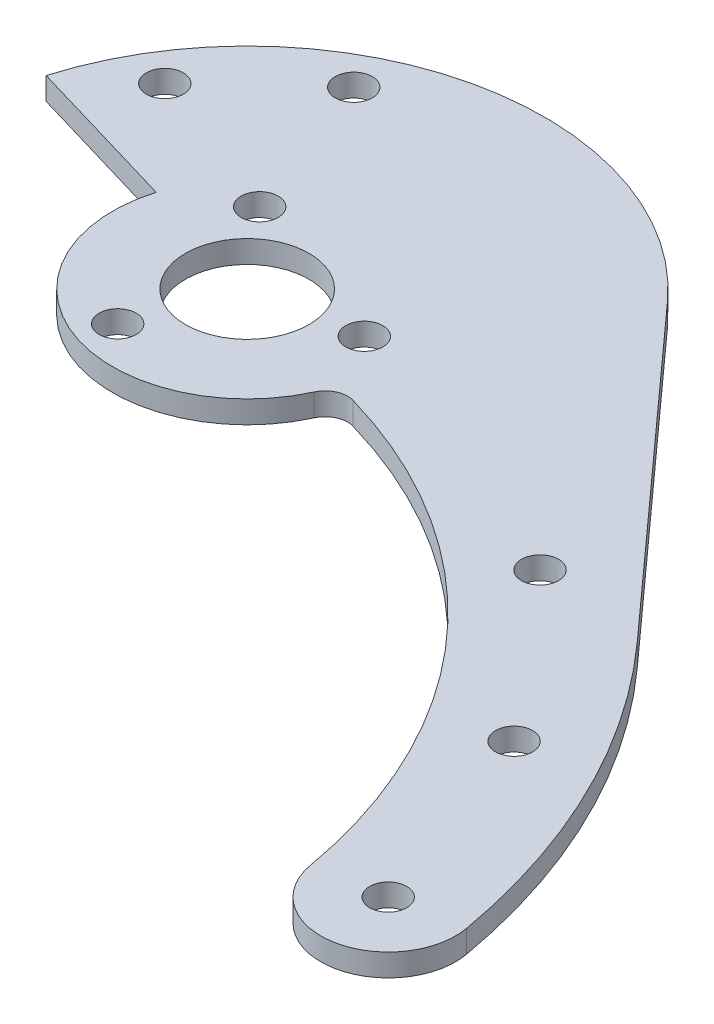
ISO-10303-21;
HEADER;
FILE_DESCRIPTION(('STEP AP214'),'2;1');
FILE_NAME('part.step','',(''),(''),'','','');
FILE_SCHEMA(('AUTOMOTIVE_DESIGN { 1 0 10303 214 1 1 1 1 }'));
ENDSEC;
DATA;
#1=APPLICATION_CONTEXT('core data for automotive mechanical design processes');
#2=APPLICATION_PROTOCOL_DEFINITION('international standard','automotive_design',2000,#1);
#3=PRODUCT_CONTEXT('',#1,'mechanical');
#4=PRODUCT('Part','Part','',(#3));
#5=PRODUCT_RELATED_PRODUCT_CATEGORY('part','',(#4));
#6=PRODUCT_DEFINITION_FORMATION('','',#4);
#7=PRODUCT_DEFINITION_CONTEXT('part definition',#1,'design');
#8=PRODUCT_DEFINITION('design','',#6,#7);
#9=PRODUCT_DEFINITION_SHAPE('','',#8);
#10=(LENGTH_UNIT() NAMED_UNIT(*) SI_UNIT(.MILLI.,.METRE.));
#11=(NAMED_UNIT(*) PLANE_ANGLE_UNIT() SI_UNIT($,.RADIAN.));
#12=(NAMED_UNIT(*) SI_UNIT($,.STERADIAN.) SOLID_ANGLE_UNIT());
#13=UNCERTAINTY_MEASURE_WITH_UNIT(LENGTH_MEASURE(1.E-05),#10,'distance_accuracy_value','');
#14=(GEOMETRIC_REPRESENTATION_CONTEXT(3) GLOBAL_UNCERTAINTY_ASSIGNED_CONTEXT((#13)) GLOBAL_UNIT_ASSIGNED_CONTEXT((#10,
#11,#12)) REPRESENTATION_CONTEXT('',''));
#15=CARTESIAN_POINT('',(0.,0.,0.));
#16=DIRECTION('',(0.,0.,1.));
#17=DIRECTION('',(1.,0.,0.));
#18=AXIS2_PLACEMENT_3D('',#15,#16,#17);
#19=CARTESIAN_POINT('',(0.,2.,0.));
#20=DIRECTION('',(0.,-1.,0.));
#21=DIRECTION('',(0.,0.,-1.));
#22=AXIS2_PLACEMENT_3D('',#19,#20,#21);
#23=PLANE('',#22);
#24=CARTESIAN_POINT('',(0.,2.,0.));
#25=DIRECTION('',(0.,1.,0.));
#26=DIRECTION('',(0.,0.,-1.));
#27=AXIS2_PLACEMENT_3D('',#24,#25,#26);
#28=CIRCLE('',#27,26.5);
#29=CARTESIAN_POINT('',(19.6725691001455,2.,-17.755));
#30=VERTEX_POINT('',#29);
#31=CARTESIAN_POINT('',(-25.4140695394413,2.,-7.50833333333332));
#32=VERTEX_POINT('',#31);
#33=EDGE_CURVE('E101',#30,#32,#28,.T.);
#34=ORIENTED_EDGE('',*,*,#33,.T.);
#35=DIRECTION('',(0.959021492054387,0.,0.283333333333333));
#36=VECTOR('',#35,1.);
#37=CARTESIAN_POINT('',(-11.5082579046527,2.,-3.39999999999999));
#38=LINE('',#37,#36);
#39=CARTESIAN_POINT('',(-11.5082579046527,2.,-3.39999999999999));
#40=VERTEX_POINT('',#39);
#41=EDGE_CURVE('E105',#32,#40,#38,.T.);
#42=ORIENTED_EDGE('',*,*,#41,.T.);
#43=CARTESIAN_POINT('',(0.,2.,0.));
#44=DIRECTION('',(0.,1.,0.));
#45=DIRECTION('',(0.,0.,1.));
#46=AXIS2_PLACEMENT_3D('',#43,#44,#45);
#47=CIRCLE('',#46,12.);
#48=CARTESIAN_POINT('',(10.9217625848205,2.,4.97142857142858));
#49=VERTEX_POINT('',#48);
#50=EDGE_CURVE('E125',#40,#49,#47,.T.);
#51=ORIENTED_EDGE('',*,*,#50,.T.);
#52=CARTESIAN_POINT('',(12.7420563489572,2.,5.80000000000001));
#53=DIRECTION('',(0.,-1.,0.));
#54=DIRECTION('',(0.,0.,-1.));
#55=AXIS2_PLACEMENT_3D('',#52,#53,#54);
#56=CIRCLE('',#55,2.);
#57=CARTESIAN_POINT('',(13.2960587989119,2.,3.87826086956523));
#58=VERTEX_POINT('',#57);
#59=EDGE_CURVE('E11',#49,#58,#56,.T.);
#60=ORIENTED_EDGE('',*,*,#59,.T.);
#61=CARTESIAN_POINT('',(0.,2.,50.));
#62=DIRECTION('',(0.,-1.,0.));
#63=DIRECTION('',(0.,0.,1.));
#64=AXIS2_PLACEMENT_3D('',#61,#62,#63);
#65=CIRCLE('',#64,48.);
#66=CARTESIAN_POINT('',(47.270772144586,2.,41.6648874719875));
#67=VERTEX_POINT('',#66);
#68=EDGE_CURVE('E127',#58,#67,#65,.T.);
#69=ORIENTED_EDGE('',*,*,#68,.T.);
#70=CARTESIAN_POINT('',(53.1796186626593,2.,40.6229984059859));
#71=DIRECTION('',(0.,1.,0.));
#72=DIRECTION('',(0.,0.,-1.));
#73=AXIS2_PLACEMENT_3D('',#70,#71,#72);
#74=CIRCLE('',#73,6.);
#75=CARTESIAN_POINT('',(59.0884651807325,2.,39.5811093399844));
#76=VERTEX_POINT('',#75);
#77=EDGE_CURVE('E132',#67,#76,#74,.T.);
#78=ORIENTED_EDGE('',*,*,#77,.T.);
#79=CARTESIAN_POINT('',(0.,2.,50.));
#80=DIRECTION('',(0.,1.,0.));
#81=DIRECTION('',(0.,0.,-1.));
#82=AXIS2_PLACEMENT_3D('',#79,#80,#81);
#83=CIRCLE('',#82,60.);
#84=CARTESIAN_POINT('',(44.5416658871219,2.,9.80000000000001));
#85=VERTEX_POINT('',#84);
#86=EDGE_CURVE('E134',#76,#85,#83,.T.);
#87=ORIENTED_EDGE('',*,*,#86,.T.);
#88=DIRECTION('',(-0.67,0.,-0.742361098118699));
#89=VECTOR('',#88,1.);
#90=CARTESIAN_POINT('',(44.5416658871219,2.,9.80000000000001));
#91=LINE('',#90,#89);
#92=EDGE_CURVE('E108',#85,#30,#91,.T.);
#93=ORIENTED_EDGE('',*,*,#92,.T.);
#94=EDGE_LOOP('',(#34,#42,#51,#60,#69,#78,#87,#93));
#95=FACE_BOUND('',#94,.T.);
#96=CARTESIAN_POINT('',(53.1796186626593,2.,40.6229984059859));
#97=DIRECTION('',(0.,1.,0.));
#98=DIRECTION('',(0.,0.,1.));
#99=AXIS2_PLACEMENT_3D('',#96,#97,#98);
#100=CIRCLE('',#99,1.65);
#101=CARTESIAN_POINT('',(53.1796186626593,2.,42.2729984059859));
#102=VERTEX_POINT('',#101);
#103=EDGE_CURVE('E140',#102,#102,#100,.T.);
#104=ORIENTED_EDGE('',*,*,#103,.F.);
#105=EDGE_LOOP('',(#104));
#106=FACE_BOUND('',#105,.T.);
#107=CARTESIAN_POINT('',(-5.7850884871789,2.,-6.89439998807076));
#108=DIRECTION('',(0.,1.,0.));
#109=DIRECTION('',(0.,0.,1.));
#110=AXIS2_PLACEMENT_3D('',#107,#108,#109);
#111=CIRCLE('',#110,1.65000000000001);
#112=CARTESIAN_POINT('',(-5.7850884871789,2.,-5.24439998807076));
#113=VERTEX_POINT('',#112);
#114=EDGE_CURVE('E406',#113,#113,#111,.T.);
#115=ORIENTED_EDGE('',*,*,#114,.F.);
#116=EDGE_LOOP('',(#115));
#117=FACE_BOUND('',#116,.T.);
#118=CARTESIAN_POINT('',(0.,2.,0.));
#119=DIRECTION('',(0.,1.,0.));
#120=DIRECTION('',(0.,0.,1.));
#121=AXIS2_PLACEMENT_3D('',#118,#119,#120);
#122=CIRCLE('',#121,5.5);
#123=CARTESIAN_POINT('',(0.,2.,5.5));
#124=VERTEX_POINT('',#123);
#125=EDGE_CURVE('E400',#124,#124,#122,.T.);
#126=ORIENTED_EDGE('',*,*,#125,.F.);
#127=EDGE_LOOP('',(#126));
#128=FACE_BOUND('',#127,.T.);
#129=CARTESIAN_POINT('',(8.86326977710986,2.,-1.56283359900243));
#130=DIRECTION('',(0.,1.,0.));
#131=DIRECTION('',(0.,0.,1.));
#132=AXIS2_PLACEMENT_3D('',#129,#130,#131);
#133=CIRCLE('',#132,1.65);
#134=CARTESIAN_POINT('',(8.86326977710986,2.,0.0871664009975707));
#135=VERTEX_POINT('',#134);
#136=EDGE_CURVE('E394',#135,#135,#133,.T.);
#137=ORIENTED_EDGE('',*,*,#136,.F.);
#138=EDGE_LOOP('',(#137));
#139=FACE_BOUND('',#138,.T.);
#140=CARTESIAN_POINT('',(-19.5137698281359,2.,-12.1742674151069));
#141=DIRECTION('',(0.,1.,0.));
#142=DIRECTION('',(0.,0.,1.));
#143=AXIS2_PLACEMENT_3D('',#140,#141,#142);
#144=CIRCLE('',#143,1.65000000000001);
#145=CARTESIAN_POINT('',(-19.5137698281359,2.,-10.5242674151069));
#146=VERTEX_POINT('',#145);
#147=EDGE_CURVE('E388',#146,#146,#144,.T.);
#148=ORIENTED_EDGE('',*,*,#147,.F.);
#149=EDGE_LOOP('',(#148));
#150=FACE_BOUND('',#149,.T.);
#151=CARTESIAN_POINT('',(-10.8122866872144,2.,-20.3001097680157));
#152=DIRECTION('',(0.,1.,0.));
#153=DIRECTION('',(0.,0.,-1.));
#154=AXIS2_PLACEMENT_3D('',#151,#152,#153);
#155=CIRCLE('',#154,1.65000000000001);
#156=CARTESIAN_POINT('',(-10.8122866872144,2.,-21.9501097680157));
#157=VERTEX_POINT('',#156);
#158=EDGE_CURVE('E382',#157,#157,#155,.T.);
#159=ORIENTED_EDGE('',*,*,#158,.F.);
#160=EDGE_LOOP('',(#159));
#161=FACE_BOUND('',#160,.T.);
#162=CARTESIAN_POINT('',(46.7653718043597,2.,23.0000000000001));
#163=DIRECTION('',(0.,1.,0.));
#164=DIRECTION('',(0.,0.,1.));
#165=AXIS2_PLACEMENT_3D('',#162,#163,#164);
#166=CIRCLE('',#165,1.65);
#167=CARTESIAN_POINT('',(46.7653718043597,2.,24.6500000000001));
#168=VERTEX_POINT('',#167);
#169=EDGE_CURVE('E376',#168,#168,#166,.T.);
#170=ORIENTED_EDGE('',*,*,#169,.F.);
#171=EDGE_LOOP('',(#170));
#172=FACE_BOUND('',#171,.T.);
#173=CARTESIAN_POINT('',(-3.07818128993097,2.,8.4572335870732));
#174=DIRECTION('',(0.,1.,0.));
#175=DIRECTION('',(0.,0.,1.));
#176=AXIS2_PLACEMENT_3D('',#173,#174,#175);
#177=CIRCLE('',#176,1.65);
#178=CARTESIAN_POINT('',(-3.07818128993097,2.,10.1072335870732));
#179=VERTEX_POINT('',#178);
#180=EDGE_CURVE('E363',#179,#179,#177,.T.);
#181=ORIENTED_EDGE('',*,*,#180,.F.);
#182=EDGE_LOOP('',(#181));
#183=FACE_BOUND('',#182,.T.);
#184=CARTESIAN_POINT('',(34.7105309230732,2.,8.63360007157523));
#185=DIRECTION('',(0.,1.,0.));
#186=DIRECTION('',(0.,0.,1.));
#187=AXIS2_PLACEMENT_3D('',#184,#185,#186);
#188=CIRCLE('',#187,1.65000000000001);
#189=CARTESIAN_POINT('',(34.7105309230732,2.,10.2836000715752));
#190=VERTEX_POINT('',#189);
#191=EDGE_CURVE('E367',#190,#190,#188,.T.);
#192=ORIENTED_EDGE('',*,*,#191,.F.);
#193=EDGE_LOOP('',(#192));
#194=FACE_BOUND('',#193,.T.);
#195=ADVANCED_FACE('F37',(#95,#106,#117,#128,#139,#150,#161,#172,#183,#194),#23,.F.);
#196=CARTESIAN_POINT('',(0.,0.,0.));
#197=DIRECTION('',(0.,-1.,0.));
#198=DIRECTION('',(0.,0.,-1.));
#199=AXIS2_PLACEMENT_3D('',#196,#197,#198);
#200=PLANE('',#199);
#201=CARTESIAN_POINT('',(-3.07818128993097,0.,8.4572335870732));
#202=DIRECTION('',(0.,1.,0.));
#203=DIRECTION('',(0.,0.,1.));
#204=AXIS2_PLACEMENT_3D('',#201,#202,#203);
#205=CIRCLE('',#204,1.65);
#206=CARTESIAN_POINT('',(-3.07818128993097,0.,10.1072335870732));
#207=VERTEX_POINT('',#206);
#208=EDGE_CURVE('E366',#207,#207,#205,.T.);
#209=ORIENTED_EDGE('',*,*,#208,.T.);
#210=EDGE_LOOP('',(#209));
#211=FACE_BOUND('',#210,.T.);
#212=CARTESIAN_POINT('',(-10.8122866872144,0.,-20.3001097680157));
#213=DIRECTION('',(0.,1.,0.));
#214=DIRECTION('',(0.,0.,-1.));
#215=AXIS2_PLACEMENT_3D('',#212,#213,#214);
#216=CIRCLE('',#215,1.65000000000001);
#217=CARTESIAN_POINT('',(-10.8122866872144,0.,-21.9501097680157));
#218=VERTEX_POINT('',#217);
#219=EDGE_CURVE('E379',#218,#218,#216,.T.);
#220=ORIENTED_EDGE('',*,*,#219,.T.);
#221=EDGE_LOOP('',(#220));
#222=FACE_BOUND('',#221,.T.);
#223=CARTESIAN_POINT('',(8.86326977710986,0.,-1.56283359900243));
#224=DIRECTION('',(0.,1.,0.));
#225=DIRECTION('',(0.,0.,1.));
#226=AXIS2_PLACEMENT_3D('',#223,#224,#225);
#227=CIRCLE('',#226,1.65);
#228=CARTESIAN_POINT('',(8.86326977710986,0.,0.0871664009975707));
#229=VERTEX_POINT('',#228);
#230=EDGE_CURVE('E391',#229,#229,#227,.T.);
#231=ORIENTED_EDGE('',*,*,#230,.T.);
#232=EDGE_LOOP('',(#231));
#233=FACE_BOUND('',#232,.T.);
#234=CARTESIAN_POINT('',(-5.7850884871789,0.,-6.89439998807076));
#235=DIRECTION('',(0.,1.,0.));
#236=DIRECTION('',(0.,0.,1.));
#237=AXIS2_PLACEMENT_3D('',#234,#235,#236);
#238=CIRCLE('',#237,1.65000000000001);
#239=CARTESIAN_POINT('',(-5.7850884871789,0.,-5.24439998807076));
#240=VERTEX_POINT('',#239);
#241=EDGE_CURVE('E403',#240,#240,#238,.T.);
#242=ORIENTED_EDGE('',*,*,#241,.T.);
#243=EDGE_LOOP('',(#242));
#244=FACE_BOUND('',#243,.T.);
#245=CARTESIAN_POINT('',(0.,0.,0.));
#246=DIRECTION('',(0.,1.,0.));
#247=DIRECTION('',(0.,0.,1.));
#248=AXIS2_PLACEMENT_3D('',#245,#246,#247);
#249=CIRCLE('',#248,26.5);
#250=CARTESIAN_POINT('',(19.6725691001455,0.,-17.755));
#251=VERTEX_POINT('',#250);
#252=CARTESIAN_POINT('',(-25.4140695394413,0.,-7.50833333333332));
#253=VERTEX_POINT('',#252);
#254=EDGE_CURVE('E117',#251,#253,#249,.T.);
#255=ORIENTED_EDGE('',*,*,#254,.F.);
#256=DIRECTION('',(-0.67,0.,-0.742361098118699));
#257=VECTOR('',#256,1.);
#258=CARTESIAN_POINT('',(44.5416658871219,0.,9.80000000000001));
#259=LINE('',#258,#257);
#260=CARTESIAN_POINT('',(44.5416658871219,0.,9.80000000000001));
#261=VERTEX_POINT('',#260);
#262=EDGE_CURVE('E112',#261,#251,#259,.T.);
#263=ORIENTED_EDGE('',*,*,#262,.F.);
#264=CARTESIAN_POINT('',(0.,0.,50.));
#265=DIRECTION('',(0.,1.,0.));
#266=DIRECTION('',(0.,0.,-1.));
#267=AXIS2_PLACEMENT_3D('',#264,#265,#266);
#268=CIRCLE('',#267,60.);
#269=CARTESIAN_POINT('',(59.0884651807325,0.,39.5811093399844));
#270=VERTEX_POINT('',#269);
#271=EDGE_CURVE('E148',#270,#261,#268,.T.);
#272=ORIENTED_EDGE('',*,*,#271,.F.);
#273=CARTESIAN_POINT('',(53.1796186626593,0.,40.6229984059859));
#274=DIRECTION('',(0.,1.,0.));
#275=DIRECTION('',(0.,0.,-1.));
#276=AXIS2_PLACEMENT_3D('',#273,#274,#275);
#277=CIRCLE('',#276,6.);
#278=CARTESIAN_POINT('',(47.270772144586,0.,41.6648874719875));
#279=VERTEX_POINT('',#278);
#280=EDGE_CURVE('E146',#279,#270,#277,.T.);
#281=ORIENTED_EDGE('',*,*,#280,.F.);
#282=CARTESIAN_POINT('',(0.,0.,50.));
#283=DIRECTION('',(0.,-1.,0.));
#284=DIRECTION('',(0.,0.,1.));
#285=AXIS2_PLACEMENT_3D('',#282,#283,#284);
#286=CIRCLE('',#285,48.);
#287=CARTESIAN_POINT('',(13.2960587989119,0.,3.87826086956523));
#288=VERTEX_POINT('',#287);
#289=EDGE_CURVE('E144',#288,#279,#286,.T.);
#290=ORIENTED_EDGE('',*,*,#289,.F.);
#291=CARTESIAN_POINT('',(12.7420563489572,0.,5.80000000000001));
#292=DIRECTION('',(0.,-1.,0.));
#293=DIRECTION('',(0.,0.,-1.));
#294=AXIS2_PLACEMENT_3D('',#291,#292,#293);
#295=CIRCLE('',#294,2.);
#296=CARTESIAN_POINT('',(10.9217625848205,0.,4.97142857142858));
#297=VERTEX_POINT('',#296);
#298=EDGE_CURVE('E45',#288,#297,#295,.F.);
#299=ORIENTED_EDGE('',*,*,#298,.T.);
#300=CARTESIAN_POINT('',(0.,0.,0.));
#301=DIRECTION('',(0.,1.,0.));
#302=DIRECTION('',(0.,0.,1.));
#303=AXIS2_PLACEMENT_3D('',#300,#301,#302);
#304=CIRCLE('',#303,12.);
#305=CARTESIAN_POINT('',(-11.5082579046527,0.,-3.39999999999999));
#306=VERTEX_POINT('',#305);
#307=EDGE_CURVE('E142',#306,#297,#304,.T.);
#308=ORIENTED_EDGE('',*,*,#307,.F.);
#309=DIRECTION('',(0.959021492054387,0.,0.283333333333333));
#310=VECTOR('',#309,1.);
#311=CARTESIAN_POINT('',(-11.5082579046527,0.,-3.39999999999999));
#312=LINE('',#311,#310);
#313=EDGE_CURVE('E139',#253,#306,#312,.T.);
#314=ORIENTED_EDGE('',*,*,#313,.F.);
#315=EDGE_LOOP('',(#255,#263,#272,#281,#290,#299,#308,#314));
#316=FACE_BOUND('',#315,.T.);
#317=CARTESIAN_POINT('',(53.1796186626593,0.,40.6229984059859));
#318=DIRECTION('',(0.,1.,0.));
#319=DIRECTION('',(0.,0.,1.));
#320=AXIS2_PLACEMENT_3D('',#317,#318,#319);
#321=CIRCLE('',#320,1.65);
#322=CARTESIAN_POINT('',(53.1796186626593,0.,42.2729984059859));
#323=VERTEX_POINT('',#322);
#324=EDGE_CURVE('E409',#323,#323,#321,.T.);
#325=ORIENTED_EDGE('',*,*,#324,.T.);
#326=EDGE_LOOP('',(#325));
#327=FACE_BOUND('',#326,.T.);
#328=CARTESIAN_POINT('',(0.,0.,0.));
#329=DIRECTION('',(0.,1.,0.));
#330=DIRECTION('',(0.,0.,1.));
#331=AXIS2_PLACEMENT_3D('',#328,#329,#330);
#332=CIRCLE('',#331,5.5);
#333=CARTESIAN_POINT('',(0.,0.,5.5));
#334=VERTEX_POINT('',#333);
#335=EDGE_CURVE('E397',#334,#334,#332,.T.);
#336=ORIENTED_EDGE('',*,*,#335,.T.);
#337=EDGE_LOOP('',(#336));
#338=FACE_BOUND('',#337,.T.);
#339=CARTESIAN_POINT('',(-19.5137698281359,0.,-12.1742674151069));
#340=DIRECTION('',(0.,1.,0.));
#341=DIRECTION('',(0.,0.,1.));
#342=AXIS2_PLACEMENT_3D('',#339,#340,#341);
#343=CIRCLE('',#342,1.65000000000001);
#344=CARTESIAN_POINT('',(-19.5137698281359,0.,-10.5242674151069));
#345=VERTEX_POINT('',#344);
#346=EDGE_CURVE('E385',#345,#345,#343,.T.);
#347=ORIENTED_EDGE('',*,*,#346,.T.);
#348=EDGE_LOOP('',(#347));
#349=FACE_BOUND('',#348,.T.);
#350=CARTESIAN_POINT('',(46.7653718043597,0.,23.0000000000001));
#351=DIRECTION('',(0.,1.,0.));
#352=DIRECTION('',(0.,0.,1.));
#353=AXIS2_PLACEMENT_3D('',#350,#351,#352);
#354=CIRCLE('',#353,1.65);
#355=CARTESIAN_POINT('',(46.7653718043597,0.,24.6500000000001));
#356=VERTEX_POINT('',#355);
#357=EDGE_CURVE('E369',#356,#356,#354,.T.);
#358=ORIENTED_EDGE('',*,*,#357,.T.);
#359=EDGE_LOOP('',(#358));
#360=FACE_BOUND('',#359,.T.);
#361=CARTESIAN_POINT('',(34.7105309230732,0.,8.63360007157523));
#362=DIRECTION('',(0.,1.,0.));
#363=DIRECTION('',(0.,0.,1.));
#364=AXIS2_PLACEMENT_3D('',#361,#362,#363);
#365=CIRCLE('',#364,1.65000000000001);
#366=CARTESIAN_POINT('',(34.7105309230732,0.,10.2836000715752));
#367=VERTEX_POINT('',#366);
#368=EDGE_CURVE('E372',#367,#367,#365,.T.);
#369=ORIENTED_EDGE('',*,*,#368,.T.);
#370=EDGE_LOOP('',(#369));
#371=FACE_BOUND('',#370,.T.);
#372=ADVANCED_FACE('F173',(#211,#222,#233,#244,#316,#327,#338,#349,#360,#371),#200,.T.);
#373=CARTESIAN_POINT('',(0.,2.,0.));
#374=DIRECTION('',(0.,-1.,0.));
#375=DIRECTION('',(0.,0.,-1.));
#376=AXIS2_PLACEMENT_3D('',#373,#374,#375);
#377=CYLINDRICAL_SURFACE('',#376,26.5);
#378=ORIENTED_EDGE('',*,*,#254,.T.);
#379=DIRECTION('',(0.,-1.,0.));
#380=VECTOR('',#379,1.);
#381=CARTESIAN_POINT('',(-25.4140695394413,2.,-7.50833333333332));
#382=LINE('',#381,#380);
#383=EDGE_CURVE('E115',#32,#253,#382,.T.);
#384=ORIENTED_EDGE('',*,*,#383,.F.);
#385=ORIENTED_EDGE('',*,*,#33,.F.);
#386=DIRECTION('',(0.,-1.,0.));
#387=VECTOR('',#386,1.);
#388=CARTESIAN_POINT('',(19.6725691001455,2.,-17.755));
#389=LINE('',#388,#387);
#390=EDGE_CURVE('E137',#30,#251,#389,.T.);
#391=ORIENTED_EDGE('',*,*,#390,.T.);
#392=EDGE_LOOP('',(#378,#384,#385,#391));
#393=FACE_BOUND('',#392,.T.);
#394=ADVANCED_FACE('F116',(#393),#377,.T.);
#395=CARTESIAN_POINT('',(-11.5082579046527,2.,-3.39999999999999));
#396=DIRECTION('',(0.283333333333333,0.,-0.959021492054387));
#397=DIRECTION('',(-0.959021492054387,0.,-0.283333333333333));
#398=AXIS2_PLACEMENT_3D('',#395,#396,#397);
#399=PLANE('',#398);
#400=ORIENTED_EDGE('',*,*,#313,.T.);
#401=DIRECTION('',(0.,-1.,0.));
#402=VECTOR('',#401,1.);
#403=CARTESIAN_POINT('',(-11.5082579046527,2.,-3.39999999999999));
#404=LINE('',#403,#402);
#405=EDGE_CURVE('E121',#40,#306,#404,.T.);
#406=ORIENTED_EDGE('',*,*,#405,.F.);
#407=ORIENTED_EDGE('',*,*,#41,.F.);
#408=ORIENTED_EDGE('',*,*,#383,.T.);
#409=EDGE_LOOP('',(#400,#406,#407,#408));
#410=FACE_BOUND('',#409,.T.);
#411=ADVANCED_FACE('F123',(#410),#399,.F.);
#412=CARTESIAN_POINT('',(0.,2.,0.));
#413=DIRECTION('',(0.,-1.,0.));
#414=DIRECTION('',(0.,0.,-1.));
#415=AXIS2_PLACEMENT_3D('',#412,#413,#414);
#416=CYLINDRICAL_SURFACE('',#415,12.);
#417=ORIENTED_EDGE('',*,*,#307,.T.);
#418=DIRECTION('',(0.,-1.,0.));
#419=VECTOR('',#418,1.);
#420=CARTESIAN_POINT('',(10.9217625848205,2.,4.97142857142858));
#421=LINE('',#420,#419);
#422=EDGE_CURVE('E52',#297,#49,#421,.F.);
#423=ORIENTED_EDGE('',*,*,#422,.T.);
#424=ORIENTED_EDGE('',*,*,#50,.F.);
#425=ORIENTED_EDGE('',*,*,#405,.T.);
#426=EDGE_LOOP('',(#417,#423,#424,#425));
#427=FACE_BOUND('',#426,.T.);
#428=ADVANCED_FACE('F214',(#427),#416,.T.);
#429=CARTESIAN_POINT('',(0.,2.,50.));
#430=DIRECTION('',(0.,-1.,0.));
#431=DIRECTION('',(0.,0.,-1.));
#432=AXIS2_PLACEMENT_3D('',#429,#430,#431);
#433=CYLINDRICAL_SURFACE('',#432,48.);
#434=ORIENTED_EDGE('',*,*,#68,.F.);
#435=DIRECTION('',(0.,-1.,0.));
#436=VECTOR('',#435,1.);
#437=CARTESIAN_POINT('',(13.2960587989119,2.,3.87826086956522));
#438=LINE('',#437,#436);
#439=EDGE_CURVE('E120',#58,#288,#438,.T.);
#440=ORIENTED_EDGE('',*,*,#439,.T.);
#441=ORIENTED_EDGE('',*,*,#289,.T.);
#442=DIRECTION('',(0.,-1.,0.));
#443=VECTOR('',#442,1.);
#444=CARTESIAN_POINT('',(47.270772144586,2.,41.6648874719875));
#445=LINE('',#444,#443);
#446=EDGE_CURVE('E159',#67,#279,#445,.T.);
#447=ORIENTED_EDGE('',*,*,#446,.F.);
#448=EDGE_LOOP('',(#434,#440,#441,#447));
#449=FACE_BOUND('',#448,.T.);
#450=ADVANCED_FACE('F168',(#449),#433,.F.);
#451=CARTESIAN_POINT('',(53.1796186626593,2.,40.6229984059859));
#452=DIRECTION('',(0.,-1.,0.));
#453=DIRECTION('',(0.,0.,-1.));
#454=AXIS2_PLACEMENT_3D('',#451,#452,#453);
#455=CYLINDRICAL_SURFACE('',#454,6.);
#456=ORIENTED_EDGE('',*,*,#280,.T.);
#457=DIRECTION('',(0.,-1.,0.));
#458=VECTOR('',#457,1.);
#459=CARTESIAN_POINT('',(59.0884651807325,2.,39.5811093399844));
#460=LINE('',#459,#458);
#461=EDGE_CURVE('E156',#76,#270,#460,.T.);
#462=ORIENTED_EDGE('',*,*,#461,.F.);
#463=ORIENTED_EDGE('',*,*,#77,.F.);
#464=ORIENTED_EDGE('',*,*,#446,.T.);
#465=EDGE_LOOP('',(#456,#462,#463,#464));
#466=FACE_BOUND('',#465,.T.);
#467=ADVANCED_FACE('F179',(#466),#455,.T.);
#468=CARTESIAN_POINT('',(0.,2.,50.));
#469=DIRECTION('',(0.,-1.,0.));
#470=DIRECTION('',(0.,0.,-1.));
#471=AXIS2_PLACEMENT_3D('',#468,#469,#470);
#472=CYLINDRICAL_SURFACE('',#471,60.);
#473=ORIENTED_EDGE('',*,*,#271,.T.);
#474=DIRECTION('',(0.,-1.,0.));
#475=VECTOR('',#474,1.);
#476=CARTESIAN_POINT('',(44.5416658871219,2.,9.80000000000001));
#477=LINE('',#476,#475);
#478=EDGE_CURVE('E153',#85,#261,#477,.T.);
#479=ORIENTED_EDGE('',*,*,#478,.F.);
#480=ORIENTED_EDGE('',*,*,#86,.F.);
#481=ORIENTED_EDGE('',*,*,#461,.T.);
#482=EDGE_LOOP('',(#473,#479,#480,#481));
#483=FACE_BOUND('',#482,.T.);
#484=ADVANCED_FACE('F183',(#483),#472,.T.);
#485=CARTESIAN_POINT('',(44.5416658871219,2.,9.80000000000001));
#486=DIRECTION('',(-0.742361098118699,0.,0.67));
#487=DIRECTION('',(0.67,0.,0.742361098118699));
#488=AXIS2_PLACEMENT_3D('',#485,#486,#487);
#489=PLANE('',#488);
#490=ORIENTED_EDGE('',*,*,#262,.T.);
#491=ORIENTED_EDGE('',*,*,#390,.F.);
#492=ORIENTED_EDGE('',*,*,#92,.F.);
#493=ORIENTED_EDGE('',*,*,#478,.T.);
#494=EDGE_LOOP('',(#490,#491,#492,#493));
#495=FACE_BOUND('',#494,.T.);
#496=ADVANCED_FACE('F204',(#495),#489,.F.);
#497=CARTESIAN_POINT('',(53.1796186626593,2.,40.6229984059859));
#498=DIRECTION('',(0.,-1.,0.));
#499=DIRECTION('',(0.,0.,-1.));
#500=AXIS2_PLACEMENT_3D('',#497,#498,#499);
#501=CYLINDRICAL_SURFACE('',#500,1.65);
#502=ORIENTED_EDGE('',*,*,#103,.T.);
#503=EDGE_LOOP('',(#502));
#504=FACE_BOUND('',#503,.T.);
#505=ORIENTED_EDGE('',*,*,#324,.F.);
#506=EDGE_LOOP('',(#505));
#507=FACE_BOUND('',#506,.T.);
#508=ADVANCED_FACE('F201',(#504,#507),#501,.F.);
#509=CARTESIAN_POINT('',(-5.7850884871789,2.,-6.89439998807076));
#510=DIRECTION('',(0.,-1.,0.));
#511=DIRECTION('',(0.,0.,-1.));
#512=AXIS2_PLACEMENT_3D('',#509,#510,#511);
#513=CYLINDRICAL_SURFACE('',#512,1.65000000000001);
#514=ORIENTED_EDGE('',*,*,#114,.T.);
#515=EDGE_LOOP('',(#514));
#516=FACE_BOUND('',#515,.T.);
#517=ORIENTED_EDGE('',*,*,#241,.F.);
#518=EDGE_LOOP('',(#517));
#519=FACE_BOUND('',#518,.T.);
#520=ADVANCED_FACE('F253',(#516,#519),#513,.F.);
#521=CARTESIAN_POINT('',(0.,2.,0.));
#522=DIRECTION('',(0.,-1.,0.));
#523=DIRECTION('',(0.,0.,-1.));
#524=AXIS2_PLACEMENT_3D('',#521,#522,#523);
#525=CYLINDRICAL_SURFACE('',#524,5.5);
#526=ORIENTED_EDGE('',*,*,#125,.T.);
#527=EDGE_LOOP('',(#526));
#528=FACE_BOUND('',#527,.T.);
#529=ORIENTED_EDGE('',*,*,#335,.F.);
#530=EDGE_LOOP('',(#529));
#531=FACE_BOUND('',#530,.T.);
#532=ADVANCED_FACE('F260',(#528,#531),#525,.F.);
#533=CARTESIAN_POINT('',(8.86326977710986,2.,-1.56283359900243));
#534=DIRECTION('',(0.,-1.,0.));
#535=DIRECTION('',(0.,0.,-1.));
#536=AXIS2_PLACEMENT_3D('',#533,#534,#535);
#537=CYLINDRICAL_SURFACE('',#536,1.65);
#538=ORIENTED_EDGE('',*,*,#136,.T.);
#539=EDGE_LOOP('',(#538));
#540=FACE_BOUND('',#539,.T.);
#541=ORIENTED_EDGE('',*,*,#230,.F.);
#542=EDGE_LOOP('',(#541));
#543=FACE_BOUND('',#542,.T.);
#544=ADVANCED_FACE('F267',(#540,#543),#537,.F.);
#545=CARTESIAN_POINT('',(-19.5137698281359,2.,-12.1742674151069));
#546=DIRECTION('',(0.,-1.,0.));
#547=DIRECTION('',(0.,0.,-1.));
#548=AXIS2_PLACEMENT_3D('',#545,#546,#547);
#549=CYLINDRICAL_SURFACE('',#548,1.65000000000001);
#550=ORIENTED_EDGE('',*,*,#147,.T.);
#551=EDGE_LOOP('',(#550));
#552=FACE_BOUND('',#551,.T.);
#553=ORIENTED_EDGE('',*,*,#346,.F.);
#554=EDGE_LOOP('',(#553));
#555=FACE_BOUND('',#554,.T.);
#556=ADVANCED_FACE('F275',(#552,#555),#549,.F.);
#557=CARTESIAN_POINT('',(-10.8122866872144,2.,-20.3001097680157));
#558=DIRECTION('',(0.,-1.,0.));
#559=DIRECTION('',(0.,0.,-1.));
#560=AXIS2_PLACEMENT_3D('',#557,#558,#559);
#561=CYLINDRICAL_SURFACE('',#560,1.65000000000001);
#562=ORIENTED_EDGE('',*,*,#158,.T.);
#563=EDGE_LOOP('',(#562));
#564=FACE_BOUND('',#563,.T.);
#565=ORIENTED_EDGE('',*,*,#219,.F.);
#566=EDGE_LOOP('',(#565));
#567=FACE_BOUND('',#566,.T.);
#568=ADVANCED_FACE('F283',(#564,#567),#561,.F.);
#569=CARTESIAN_POINT('',(46.7653718043597,2.,23.0000000000001));
#570=DIRECTION('',(0.,-1.,0.));
#571=DIRECTION('',(0.,0.,-1.));
#572=AXIS2_PLACEMENT_3D('',#569,#570,#571);
#573=CYLINDRICAL_SURFACE('',#572,1.65);
#574=ORIENTED_EDGE('',*,*,#169,.T.);
#575=EDGE_LOOP('',(#574));
#576=FACE_BOUND('',#575,.T.);
#577=ORIENTED_EDGE('',*,*,#357,.F.);
#578=EDGE_LOOP('',(#577));
#579=FACE_BOUND('',#578,.T.);
#580=ADVANCED_FACE('F291',(#576,#579),#573,.F.);
#581=CARTESIAN_POINT('',(-3.07818128993097,2.,8.4572335870732));
#582=DIRECTION('',(0.,-1.,0.));
#583=DIRECTION('',(0.,0.,-1.));
#584=AXIS2_PLACEMENT_3D('',#581,#582,#583);
#585=CYLINDRICAL_SURFACE('',#584,1.65);
#586=ORIENTED_EDGE('',*,*,#180,.T.);
#587=EDGE_LOOP('',(#586));
#588=FACE_BOUND('',#587,.T.);
#589=ORIENTED_EDGE('',*,*,#208,.F.);
#590=EDGE_LOOP('',(#589));
#591=FACE_BOUND('',#590,.T.);
#592=ADVANCED_FACE('F190',(#588,#591),#585,.F.);
#593=CARTESIAN_POINT('',(34.7105309230732,2.,8.63360007157523));
#594=DIRECTION('',(0.,-1.,0.));
#595=DIRECTION('',(0.,0.,-1.));
#596=AXIS2_PLACEMENT_3D('',#593,#594,#595);
#597=CYLINDRICAL_SURFACE('',#596,1.65000000000001);
#598=ORIENTED_EDGE('',*,*,#191,.T.);
#599=EDGE_LOOP('',(#598));
#600=FACE_BOUND('',#599,.T.);
#601=ORIENTED_EDGE('',*,*,#368,.F.);
#602=EDGE_LOOP('',(#601));
#603=FACE_BOUND('',#602,.T.);
#604=ADVANCED_FACE('F186',(#600,#603),#597,.F.);
#605=CARTESIAN_POINT('',(12.7420563489572,2.,5.80000000000001));
#606=DIRECTION('',(0.,-1.,0.));
#607=DIRECTION('',(0.,0.,-1.));
#608=AXIS2_PLACEMENT_3D('',#605,#606,#607);
#609=CYLINDRICAL_SURFACE('',#608,2.);
#610=ORIENTED_EDGE('',*,*,#59,.F.);
#611=ORIENTED_EDGE('',*,*,#422,.F.);
#612=ORIENTED_EDGE('',*,*,#298,.F.);
#613=ORIENTED_EDGE('',*,*,#439,.F.);
#614=EDGE_LOOP('',(#610,#611,#612,#613));
#615=FACE_BOUND('',#614,.T.);
#616=ADVANCED_FACE('F39',(#615),#609,.F.);
#617=CLOSED_SHELL('',(#195,#372,#394,#411,#428,#450,#467,#484,#496,#508,#520,#532,#544,#556,
#568,#580,#592,#604,#616));
#618=MANIFOLD_SOLID_BREP('B2',#617);
#619=ADVANCED_BREP_SHAPE_REPRESENTATION('',(#18,#618),#14);
#620=SHAPE_DEFINITION_REPRESENTATION(#9,#619);
ENDSEC;
END-ISO-10303-21;
